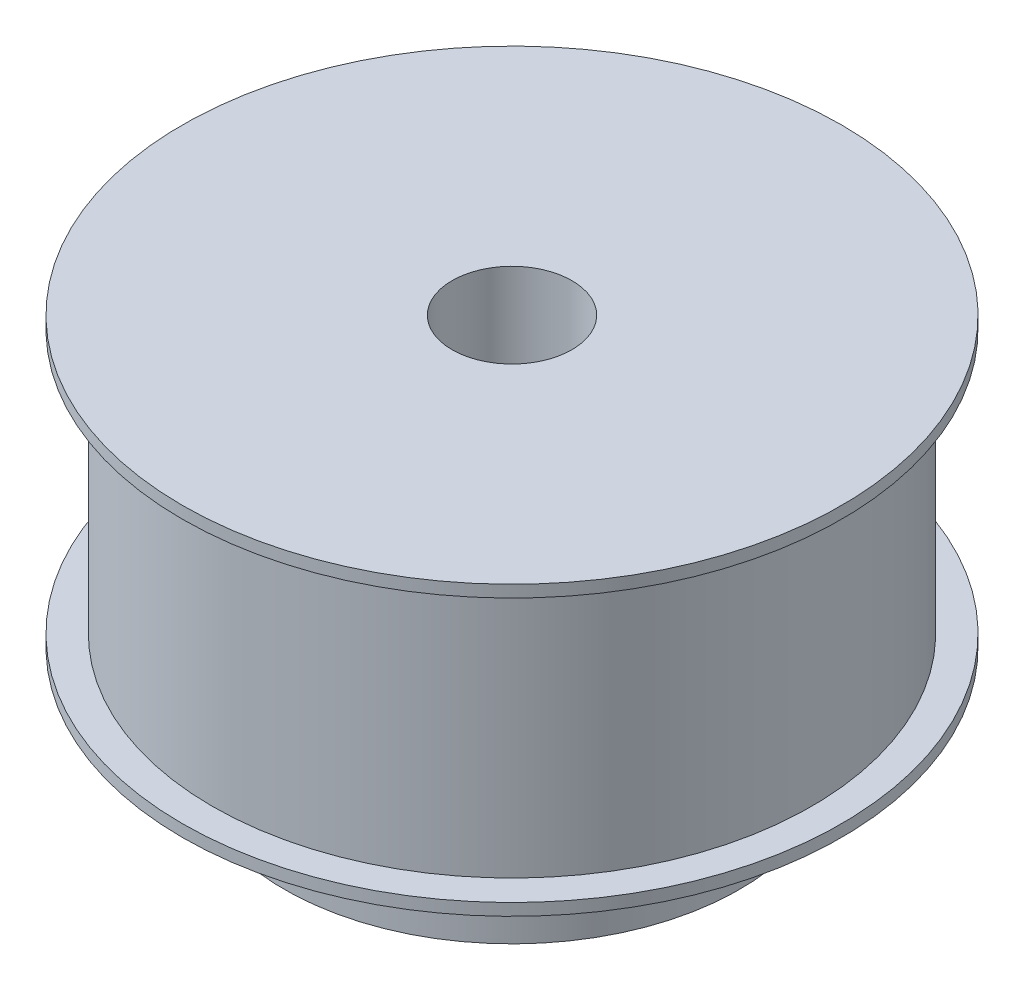
ISO-10303-21;
HEADER;
FILE_DESCRIPTION(('STEP AP214'),'2;1');
FILE_NAME('part.step','',(''),(''),'','','');
FILE_SCHEMA(('AUTOMOTIVE_DESIGN { 1 0 10303 214 1 1 1 1 }'));
ENDSEC;
DATA;
#1=APPLICATION_CONTEXT('core data for automotive mechanical design processes');
#2=APPLICATION_PROTOCOL_DEFINITION('international standard','automotive_design',2000,#1);
#3=PRODUCT_CONTEXT('',#1,'mechanical');
#4=PRODUCT('Part','Part','',(#3));
#5=PRODUCT_RELATED_PRODUCT_CATEGORY('part','',(#4));
#6=PRODUCT_DEFINITION_FORMATION('','',#4);
#7=PRODUCT_DEFINITION_CONTEXT('part definition',#1,'design');
#8=PRODUCT_DEFINITION('design','',#6,#7);
#9=PRODUCT_DEFINITION_SHAPE('','',#8);
#10=(LENGTH_UNIT() NAMED_UNIT(*) SI_UNIT(.MILLI.,.METRE.));
#11=(NAMED_UNIT(*) PLANE_ANGLE_UNIT() SI_UNIT($,.RADIAN.));
#12=(NAMED_UNIT(*) SI_UNIT($,.STERADIAN.) SOLID_ANGLE_UNIT());
#13=UNCERTAINTY_MEASURE_WITH_UNIT(LENGTH_MEASURE(1.E-05),#10,'distance_accuracy_value','');
#14=(GEOMETRIC_REPRESENTATION_CONTEXT(3) GLOBAL_UNCERTAINTY_ASSIGNED_CONTEXT((#13)) GLOBAL_UNIT_ASSIGNED_CONTEXT((#10,
#11,#12)) REPRESENTATION_CONTEXT('',''));
#15=CARTESIAN_POINT('',(0.,0.,0.));
#16=DIRECTION('',(0.,0.,1.));
#17=DIRECTION('',(1.,0.,0.));
#18=AXIS2_PLACEMENT_3D('',#15,#16,#17);
#19=CARTESIAN_POINT('',(0.,23.,0.));
#20=DIRECTION('',(0.,-1.,0.));
#21=DIRECTION('',(0.,0.,-1.));
#22=AXIS2_PLACEMENT_3D('',#19,#20,#21);
#23=PLANE('',#22);
#24=CARTESIAN_POINT('',(0.,23.,0.));
#25=DIRECTION('',(0.,1.,0.));
#26=DIRECTION('',(0.,0.,1.));
#27=AXIS2_PLACEMENT_3D('',#24,#25,#26);
#28=CIRCLE('',#27,5.);
#29=CARTESIAN_POINT('',(0.,23.,5.));
#30=VERTEX_POINT('',#29);
#31=EDGE_CURVE('E62',#30,#30,#28,.T.);
#32=ORIENTED_EDGE('',*,*,#31,.F.);
#33=EDGE_LOOP('',(#32));
#34=FACE_BOUND('',#33,.T.);
#35=CARTESIAN_POINT('',(0.,23.,0.));
#36=DIRECTION('',(0.,-1.,0.));
#37=DIRECTION('',(0.,0.,-1.));
#38=AXIS2_PLACEMENT_3D('',#35,#36,#37);
#39=CIRCLE('',#38,27.5);
#40=CARTESIAN_POINT('',(0.,23.,-27.5));
#41=VERTEX_POINT('',#40);
#42=EDGE_CURVE('E59',#41,#41,#39,.T.);
#43=ORIENTED_EDGE('',*,*,#42,.F.);
#44=EDGE_LOOP('',(#43));
#45=FACE_BOUND('',#44,.T.);
#46=ADVANCED_FACE('F31',(#34,#45),#23,.F.);
#47=CARTESIAN_POINT('',(0.,-9.00000000000001,0.));
#48=DIRECTION('',(0.,1.,0.));
#49=DIRECTION('',(0.,0.,1.));
#50=AXIS2_PLACEMENT_3D('',#47,#48,#49);
#51=PLANE('',#50);
#52=CARTESIAN_POINT('',(0.,-9.00000000000001,0.));
#53=DIRECTION('',(0.,1.,0.));
#54=DIRECTION('',(0.,0.,1.));
#55=AXIS2_PLACEMENT_3D('',#52,#53,#54);
#56=CIRCLE('',#55,5.);
#57=CARTESIAN_POINT('',(0.,-9.00000000000001,5.));
#58=VERTEX_POINT('',#57);
#59=EDGE_CURVE('E34',#58,#58,#56,.T.);
#60=ORIENTED_EDGE('',*,*,#59,.T.);
#61=EDGE_LOOP('',(#60));
#62=FACE_BOUND('',#61,.T.);
#63=CARTESIAN_POINT('',(0.,-9.00000000000001,0.));
#64=DIRECTION('',(0.,-1.,0.));
#65=DIRECTION('',(0.,0.,-1.));
#66=AXIS2_PLACEMENT_3D('',#63,#64,#65);
#67=CIRCLE('',#66,19.);
#68=CARTESIAN_POINT('',(0.,-9.00000000000001,-19.));
#69=VERTEX_POINT('',#68);
#70=EDGE_CURVE('E10',#69,#69,#67,.T.);
#71=ORIENTED_EDGE('',*,*,#70,.T.);
#72=EDGE_LOOP('',(#71));
#73=FACE_BOUND('',#72,.T.);
#74=ADVANCED_FACE('F69',(#62,#73),#51,.F.);
#75=CARTESIAN_POINT('',(0.,0.,0.));
#76=DIRECTION('',(0.,-1.,0.));
#77=DIRECTION('',(0.,0.,-1.));
#78=AXIS2_PLACEMENT_3D('',#75,#76,#77);
#79=CYLINDRICAL_SURFACE('',#78,19.);
#80=ORIENTED_EDGE('',*,*,#70,.F.);
#81=EDGE_LOOP('',(#80));
#82=FACE_BOUND('',#81,.T.);
#83=CARTESIAN_POINT('',(0.,-1.,0.));
#84=DIRECTION('',(0.,-1.,0.));
#85=DIRECTION('',(0.,0.,-1.));
#86=AXIS2_PLACEMENT_3D('',#83,#84,#85);
#87=CIRCLE('',#86,19.);
#88=CARTESIAN_POINT('',(0.,-1.,-19.));
#89=VERTEX_POINT('',#88);
#90=EDGE_CURVE('E38',#89,#89,#87,.T.);
#91=ORIENTED_EDGE('',*,*,#90,.T.);
#92=EDGE_LOOP('',(#91));
#93=FACE_BOUND('',#92,.T.);
#94=ADVANCED_FACE('F87',(#82,#93),#79,.T.);
#95=CARTESIAN_POINT('',(-19.,-1.00000000000001,0.));
#96=DIRECTION('',(0.,1.,0.));
#97=DIRECTION('',(0.,0.,1.));
#98=AXIS2_PLACEMENT_3D('',#95,#96,#97);
#99=PLANE('',#98);
#100=ORIENTED_EDGE('',*,*,#90,.F.);
#101=EDGE_LOOP('',(#100));
#102=FACE_BOUND('',#101,.T.);
#103=CARTESIAN_POINT('',(0.,-1.00000000000001,0.));
#104=DIRECTION('',(0.,-1.,0.));
#105=DIRECTION('',(0.,0.,-1.));
#106=AXIS2_PLACEMENT_3D('',#103,#104,#105);
#107=CIRCLE('',#106,27.5);
#108=CARTESIAN_POINT('',(0.,-1.00000000000001,-27.5));
#109=VERTEX_POINT('',#108);
#110=EDGE_CURVE('E42',#109,#109,#107,.T.);
#111=ORIENTED_EDGE('',*,*,#110,.T.);
#112=EDGE_LOOP('',(#111));
#113=FACE_BOUND('',#112,.T.);
#114=ADVANCED_FACE('F94',(#102,#113),#99,.F.);
#115=CARTESIAN_POINT('',(0.,0.,0.));
#116=DIRECTION('',(0.,-1.,0.));
#117=DIRECTION('',(0.,0.,-1.));
#118=AXIS2_PLACEMENT_3D('',#115,#116,#117);
#119=CYLINDRICAL_SURFACE('',#118,27.5);
#120=ORIENTED_EDGE('',*,*,#110,.F.);
#121=EDGE_LOOP('',(#120));
#122=FACE_BOUND('',#121,.T.);
#123=CARTESIAN_POINT('',(0.,0.,0.));
#124=DIRECTION('',(0.,-1.,0.));
#125=DIRECTION('',(0.,0.,-1.));
#126=AXIS2_PLACEMENT_3D('',#123,#124,#125);
#127=CIRCLE('',#126,27.5);
#128=CARTESIAN_POINT('',(0.,0.,-27.5));
#129=VERTEX_POINT('',#128);
#130=EDGE_CURVE('E47',#129,#129,#127,.T.);
#131=ORIENTED_EDGE('',*,*,#130,.T.);
#132=EDGE_LOOP('',(#131));
#133=FACE_BOUND('',#132,.T.);
#134=ADVANCED_FACE('F100',(#122,#133),#119,.T.);
#135=CARTESIAN_POINT('',(-25.,0.,0.));
#136=DIRECTION('',(0.,-1.,0.));
#137=DIRECTION('',(0.,0.,-1.));
#138=AXIS2_PLACEMENT_3D('',#135,#136,#137);
#139=PLANE('',#138);
#140=ORIENTED_EDGE('',*,*,#130,.F.);
#141=EDGE_LOOP('',(#140));
#142=FACE_BOUND('',#141,.T.);
#143=CARTESIAN_POINT('',(0.,0.,0.));
#144=DIRECTION('',(0.,-1.,0.));
#145=DIRECTION('',(0.,0.,-1.));
#146=AXIS2_PLACEMENT_3D('',#143,#144,#145);
#147=CIRCLE('',#146,25.);
#148=CARTESIAN_POINT('',(0.,0.,-25.));
#149=VERTEX_POINT('',#148);
#150=EDGE_CURVE('E50',#149,#149,#147,.T.);
#151=ORIENTED_EDGE('',*,*,#150,.T.);
#152=EDGE_LOOP('',(#151));
#153=FACE_BOUND('',#152,.T.);
#154=ADVANCED_FACE('F104',(#142,#153),#139,.F.);
#155=CARTESIAN_POINT('',(0.,0.,0.));
#156=DIRECTION('',(0.,-1.,0.));
#157=DIRECTION('',(0.,0.,-1.));
#158=AXIS2_PLACEMENT_3D('',#155,#156,#157);
#159=CYLINDRICAL_SURFACE('',#158,25.);
#160=ORIENTED_EDGE('',*,*,#150,.F.);
#161=EDGE_LOOP('',(#160));
#162=FACE_BOUND('',#161,.T.);
#163=CARTESIAN_POINT('',(0.,22.,0.));
#164=DIRECTION('',(0.,-1.,0.));
#165=DIRECTION('',(0.,0.,-1.));
#166=AXIS2_PLACEMENT_3D('',#163,#164,#165);
#167=CIRCLE('',#166,25.);
#168=CARTESIAN_POINT('',(0.,22.,-25.));
#169=VERTEX_POINT('',#168);
#170=EDGE_CURVE('E53',#169,#169,#167,.T.);
#171=ORIENTED_EDGE('',*,*,#170,.T.);
#172=EDGE_LOOP('',(#171));
#173=FACE_BOUND('',#172,.T.);
#174=ADVANCED_FACE('F108',(#162,#173),#159,.T.);
#175=CARTESIAN_POINT('',(-25.,22.,0.));
#176=DIRECTION('',(0.,1.,0.));
#177=DIRECTION('',(0.,0.,1.));
#178=AXIS2_PLACEMENT_3D('',#175,#176,#177);
#179=PLANE('',#178);
#180=ORIENTED_EDGE('',*,*,#170,.F.);
#181=EDGE_LOOP('',(#180));
#182=FACE_BOUND('',#181,.T.);
#183=CARTESIAN_POINT('',(0.,22.,0.));
#184=DIRECTION('',(0.,-1.,0.));
#185=DIRECTION('',(0.,0.,-1.));
#186=AXIS2_PLACEMENT_3D('',#183,#184,#185);
#187=CIRCLE('',#186,27.5);
#188=CARTESIAN_POINT('',(0.,22.,-27.5));
#189=VERTEX_POINT('',#188);
#190=EDGE_CURVE('E56',#189,#189,#187,.T.);
#191=ORIENTED_EDGE('',*,*,#190,.T.);
#192=EDGE_LOOP('',(#191));
#193=FACE_BOUND('',#192,.T.);
#194=ADVANCED_FACE('F78',(#182,#193),#179,.F.);
#195=CARTESIAN_POINT('',(0.,0.,0.));
#196=DIRECTION('',(0.,-1.,0.));
#197=DIRECTION('',(0.,0.,-1.));
#198=AXIS2_PLACEMENT_3D('',#195,#196,#197);
#199=CYLINDRICAL_SURFACE('',#198,27.5);
#200=ORIENTED_EDGE('',*,*,#190,.F.);
#201=EDGE_LOOP('',(#200));
#202=FACE_BOUND('',#201,.T.);
#203=ORIENTED_EDGE('',*,*,#42,.T.);
#204=EDGE_LOOP('',(#203));
#205=FACE_BOUND('',#204,.T.);
#206=ADVANCED_FACE('F73',(#202,#205),#199,.T.);
#207=CARTESIAN_POINT('',(0.,-11.,0.));
#208=DIRECTION('',(0.,1.,0.));
#209=DIRECTION('',(0.,0.,1.));
#210=AXIS2_PLACEMENT_3D('',#207,#208,#209);
#211=CYLINDRICAL_SURFACE('',#210,5.);
#212=ORIENTED_EDGE('',*,*,#31,.T.);
#213=EDGE_LOOP('',(#212));
#214=FACE_BOUND('',#213,.T.);
#215=ORIENTED_EDGE('',*,*,#59,.F.);
#216=EDGE_LOOP('',(#215));
#217=FACE_BOUND('',#216,.T.);
#218=ADVANCED_FACE('F71',(#214,#217),#211,.F.);
#219=CLOSED_SHELL('',(#46,#74,#94,#114,#134,#154,#174,#194,#206,#218));
#220=MANIFOLD_SOLID_BREP('B2',#219);
#221=ADVANCED_BREP_SHAPE_REPRESENTATION('',(#18,#220),#14);
#222=SHAPE_DEFINITION_REPRESENTATION(#9,#221);
ENDSEC;
END-ISO-10303-21;
